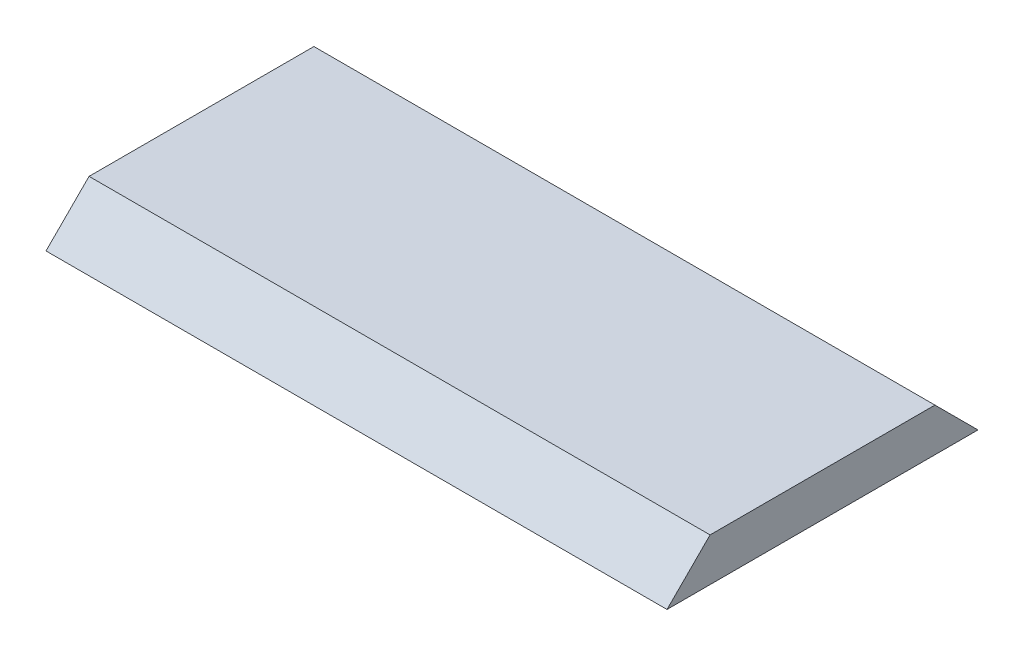
ISO-10303-21;
HEADER;
FILE_DESCRIPTION(('STEP AP214'),'2;1');
FILE_NAME('part.step','',(''),(''),'','','');
FILE_SCHEMA(('AUTOMOTIVE_DESIGN { 1 0 10303 214 1 1 1 1 }'));
ENDSEC;
DATA;
#1=APPLICATION_CONTEXT('core data for automotive mechanical design processes');
#2=APPLICATION_PROTOCOL_DEFINITION('international standard','automotive_design',2000,#1);
#3=PRODUCT_CONTEXT('',#1,'mechanical');
#4=PRODUCT('Part','Part','',(#3));
#5=PRODUCT_RELATED_PRODUCT_CATEGORY('part','',(#4));
#6=PRODUCT_DEFINITION_FORMATION('','',#4);
#7=PRODUCT_DEFINITION_CONTEXT('part definition',#1,'design');
#8=PRODUCT_DEFINITION('design','',#6,#7);
#9=PRODUCT_DEFINITION_SHAPE('','',#8);
#10=(LENGTH_UNIT() NAMED_UNIT(*) SI_UNIT(.MILLI.,.METRE.));
#11=(NAMED_UNIT(*) PLANE_ANGLE_UNIT() SI_UNIT($,.RADIAN.));
#12=(NAMED_UNIT(*) SI_UNIT($,.STERADIAN.) SOLID_ANGLE_UNIT());
#13=UNCERTAINTY_MEASURE_WITH_UNIT(LENGTH_MEASURE(1.E-05),#10,'distance_accuracy_value','');
#14=(GEOMETRIC_REPRESENTATION_CONTEXT(3) GLOBAL_UNCERTAINTY_ASSIGNED_CONTEXT((#13)) GLOBAL_UNIT_ASSIGNED_CONTEXT((#10,
#11,#12)) REPRESENTATION_CONTEXT('',''));
#15=CARTESIAN_POINT('',(0.,0.,0.));
#16=DIRECTION('',(0.,0.,1.));
#17=DIRECTION('',(1.,0.,0.));
#18=AXIS2_PLACEMENT_3D('',#15,#16,#17);
#19=CARTESIAN_POINT('',(64.9,9.,-32.5));
#20=DIRECTION('',(-1.,0.,0.));
#21=DIRECTION('',(0.,0.,1.));
#22=AXIS2_PLACEMENT_3D('',#19,#20,#21);
#23=PLANE('',#22);
#24=DIRECTION('',(0.,0.,-1.));
#25=VECTOR('',#24,1.);
#26=CARTESIAN_POINT('',(64.9,9.,-32.5));
#27=LINE('',#26,#25);
#28=CARTESIAN_POINT('',(64.9,9.,23.5));
#29=VERTEX_POINT('',#28);
#30=CARTESIAN_POINT('',(64.9,9.,-23.5));
#31=VERTEX_POINT('',#30);
#32=EDGE_CURVE('E110',#29,#31,#27,.T.);
#33=ORIENTED_EDGE('',*,*,#32,.F.);
#34=DIRECTION('',(0.,-0.707106781186549,0.707106781186546));
#35=VECTOR('',#34,1.);
#36=CARTESIAN_POINT('',(64.9,8.99999999999999,23.5));
#37=LINE('',#36,#35);
#38=CARTESIAN_POINT('',(64.9,0.,32.5));
#39=VERTEX_POINT('',#38);
#40=EDGE_CURVE('E95',#29,#39,#37,.T.);
#41=ORIENTED_EDGE('',*,*,#40,.T.);
#42=DIRECTION('',(0.,0.,-1.));
#43=VECTOR('',#42,1.);
#44=CARTESIAN_POINT('',(64.9,0.,-32.5));
#45=LINE('',#44,#43);
#46=CARTESIAN_POINT('',(64.9,0.,-32.5));
#47=VERTEX_POINT('',#46);
#48=EDGE_CURVE('E86',#39,#47,#45,.T.);
#49=ORIENTED_EDGE('',*,*,#48,.T.);
#50=DIRECTION('',(0.,0.707106781186549,0.707106781186546));
#51=VECTOR('',#50,1.);
#52=CARTESIAN_POINT('',(64.9,9.00000000000001,-23.5));
#53=LINE('',#52,#51);
#54=EDGE_CURVE('E93',#47,#31,#53,.T.);
#55=ORIENTED_EDGE('',*,*,#54,.T.);
#56=EDGE_LOOP('',(#33,#41,#49,#55));
#57=FACE_BOUND('',#56,.T.);
#58=ADVANCED_FACE('F41',(#57),#23,.F.);
#59=CARTESIAN_POINT('',(-64.9,9.,-32.5));
#60=DIRECTION('',(1.,0.,0.));
#61=DIRECTION('',(0.,0.,-1.));
#62=AXIS2_PLACEMENT_3D('',#59,#60,#61);
#63=PLANE('',#62);
#64=DIRECTION('',(0.,0.,1.));
#65=VECTOR('',#64,1.);
#66=CARTESIAN_POINT('',(-64.9,0.,-32.5));
#67=LINE('',#66,#65);
#68=CARTESIAN_POINT('',(-64.9,0.,-32.5));
#69=VERTEX_POINT('',#68);
#70=CARTESIAN_POINT('',(-64.9,0.,32.5));
#71=VERTEX_POINT('',#70);
#72=EDGE_CURVE('E88',#69,#71,#67,.T.);
#73=ORIENTED_EDGE('',*,*,#72,.T.);
#74=DIRECTION('',(0.,0.707106781186549,-0.707106781186546));
#75=VECTOR('',#74,1.);
#76=CARTESIAN_POINT('',(-64.9,8.99999999999999,23.5));
#77=LINE('',#76,#75);
#78=CARTESIAN_POINT('',(-64.9,9.,23.5));
#79=VERTEX_POINT('',#78);
#80=EDGE_CURVE('E11',#71,#79,#77,.T.);
#81=ORIENTED_EDGE('',*,*,#80,.T.);
#82=DIRECTION('',(0.,0.,1.));
#83=VECTOR('',#82,1.);
#84=CARTESIAN_POINT('',(-64.9,9.,-32.5));
#85=LINE('',#84,#83);
#86=CARTESIAN_POINT('',(-64.9,9.,-23.5));
#87=VERTEX_POINT('',#86);
#88=EDGE_CURVE('E106',#87,#79,#85,.T.);
#89=ORIENTED_EDGE('',*,*,#88,.F.);
#90=DIRECTION('',(0.,-0.707106781186549,-0.707106781186546));
#91=VECTOR('',#90,1.);
#92=CARTESIAN_POINT('',(-64.9,9.00000000000001,-23.5));
#93=LINE('',#92,#91);
#94=EDGE_CURVE('E50',#87,#69,#93,.T.);
#95=ORIENTED_EDGE('',*,*,#94,.T.);
#96=EDGE_LOOP('',(#73,#81,#89,#95));
#97=FACE_BOUND('',#96,.T.);
#98=ADVANCED_FACE('F105',(#97),#63,.F.);
#99=CARTESIAN_POINT('',(0.,9.,0.));
#100=DIRECTION('',(0.,1.,0.));
#101=DIRECTION('',(0.,0.,1.));
#102=AXIS2_PLACEMENT_3D('',#99,#100,#101);
#103=PLANE('',#102);
#104=ORIENTED_EDGE('',*,*,#88,.T.);
#105=DIRECTION('',(1.,0.,0.));
#106=VECTOR('',#105,1.);
#107=CARTESIAN_POINT('',(64.9,9.,23.5));
#108=LINE('',#107,#106);
#109=EDGE_CURVE('E99',#79,#29,#108,.T.);
#110=ORIENTED_EDGE('',*,*,#109,.T.);
#111=ORIENTED_EDGE('',*,*,#32,.T.);
#112=DIRECTION('',(-1.,0.,0.));
#113=VECTOR('',#112,1.);
#114=CARTESIAN_POINT('',(-64.9,9.,-23.5));
#115=LINE('',#114,#113);
#116=EDGE_CURVE('E98',#31,#87,#115,.T.);
#117=ORIENTED_EDGE('',*,*,#116,.T.);
#118=EDGE_LOOP('',(#104,#110,#111,#117));
#119=FACE_BOUND('',#118,.T.);
#120=ADVANCED_FACE('F152',(#119),#103,.T.);
#121=CARTESIAN_POINT('',(0.,0.,0.));
#122=DIRECTION('',(0.,1.,0.));
#123=DIRECTION('',(0.,0.,1.));
#124=AXIS2_PLACEMENT_3D('',#121,#122,#123);
#125=PLANE('',#124);
#126=CARTESIAN_POINT('',(-32.45,0.,-20.));
#127=DIRECTION('',(0.,1.,0.));
#128=DIRECTION('',(0.,0.,1.));
#129=AXIS2_PLACEMENT_3D('',#126,#127,#128);
#130=CIRCLE('',#129,3.35000000000003);
#131=CARTESIAN_POINT('',(-32.45,0.,-16.65));
#132=VERTEX_POINT('',#131);
#133=EDGE_CURVE('E135',#132,#132,#130,.T.);
#134=ORIENTED_EDGE('',*,*,#133,.T.);
#135=EDGE_LOOP('',(#134));
#136=FACE_BOUND('',#135,.T.);
#137=CARTESIAN_POINT('',(0.,0.,-20.));
#138=DIRECTION('',(0.,1.,0.));
#139=DIRECTION('',(0.,0.,1.));
#140=AXIS2_PLACEMENT_3D('',#137,#138,#139);
#141=CIRCLE('',#140,3.35000000000003);
#142=CARTESIAN_POINT('',(0.,0.,-16.65));
#143=VERTEX_POINT('',#142);
#144=EDGE_CURVE('E132',#143,#143,#141,.T.);
#145=ORIENTED_EDGE('',*,*,#144,.T.);
#146=EDGE_LOOP('',(#145));
#147=FACE_BOUND('',#146,.T.);
#148=CARTESIAN_POINT('',(32.45,0.,-20.));
#149=DIRECTION('',(0.,1.,0.));
#150=DIRECTION('',(0.,0.,1.));
#151=AXIS2_PLACEMENT_3D('',#148,#149,#150);
#152=CIRCLE('',#151,3.35000000000003);
#153=CARTESIAN_POINT('',(32.45,0.,-16.65));
#154=VERTEX_POINT('',#153);
#155=EDGE_CURVE('E129',#154,#154,#152,.T.);
#156=ORIENTED_EDGE('',*,*,#155,.T.);
#157=EDGE_LOOP('',(#156));
#158=FACE_BOUND('',#157,.T.);
#159=CARTESIAN_POINT('',(32.45,0.,20.));
#160=DIRECTION('',(0.,1.,0.));
#161=DIRECTION('',(0.,0.,1.));
#162=AXIS2_PLACEMENT_3D('',#159,#160,#161);
#163=CIRCLE('',#162,3.35000000000003);
#164=CARTESIAN_POINT('',(32.45,0.,23.35));
#165=VERTEX_POINT('',#164);
#166=EDGE_CURVE('E126',#165,#165,#163,.T.);
#167=ORIENTED_EDGE('',*,*,#166,.T.);
#168=EDGE_LOOP('',(#167));
#169=FACE_BOUND('',#168,.T.);
#170=CARTESIAN_POINT('',(0.,0.,20.));
#171=DIRECTION('',(0.,1.,0.));
#172=DIRECTION('',(0.,0.,1.));
#173=AXIS2_PLACEMENT_3D('',#170,#171,#172);
#174=CIRCLE('',#173,3.35000000000003);
#175=CARTESIAN_POINT('',(0.,0.,23.35));
#176=VERTEX_POINT('',#175);
#177=EDGE_CURVE('E123',#176,#176,#174,.T.);
#178=ORIENTED_EDGE('',*,*,#177,.T.);
#179=EDGE_LOOP('',(#178));
#180=FACE_BOUND('',#179,.T.);
#181=CARTESIAN_POINT('',(-32.45,0.,20.));
#182=DIRECTION('',(0.,1.,0.));
#183=DIRECTION('',(0.,0.,1.));
#184=AXIS2_PLACEMENT_3D('',#181,#182,#183);
#185=CIRCLE('',#184,3.35000000000003);
#186=CARTESIAN_POINT('',(-32.45,0.,23.35));
#187=VERTEX_POINT('',#186);
#188=EDGE_CURVE('E113',#187,#187,#185,.T.);
#189=ORIENTED_EDGE('',*,*,#188,.T.);
#190=EDGE_LOOP('',(#189));
#191=FACE_BOUND('',#190,.T.);
#192=ORIENTED_EDGE('',*,*,#48,.F.);
#193=DIRECTION('',(1.,0.,0.));
#194=VECTOR('',#193,1.);
#195=CARTESIAN_POINT('',(-64.9,0.,32.5));
#196=LINE('',#195,#194);
#197=EDGE_CURVE('E115',#71,#39,#196,.T.);
#198=ORIENTED_EDGE('',*,*,#197,.F.);
#199=ORIENTED_EDGE('',*,*,#72,.F.);
#200=DIRECTION('',(-1.,0.,0.));
#201=VECTOR('',#200,1.);
#202=CARTESIAN_POINT('',(-64.9,0.,-32.5));
#203=LINE('',#202,#201);
#204=EDGE_CURVE('E82',#47,#69,#203,.T.);
#205=ORIENTED_EDGE('',*,*,#204,.F.);
#206=EDGE_LOOP('',(#192,#198,#199,#205));
#207=FACE_BOUND('',#206,.T.);
#208=ADVANCED_FACE('F84',(#136,#147,#158,#169,#180,#191,#207),#125,.F.);
#209=CARTESIAN_POINT('',(-32.45,8.,20.));
#210=DIRECTION('',(0.,-1.,0.));
#211=DIRECTION('',(0.,0.,-1.));
#212=AXIS2_PLACEMENT_3D('',#209,#210,#211);
#213=CYLINDRICAL_SURFACE('',#212,2.35);
#214=CARTESIAN_POINT('',(-32.45,1.00000000000003,20.));
#215=DIRECTION('',(0.,1.,0.));
#216=DIRECTION('',(0.,0.,1.));
#217=AXIS2_PLACEMENT_3D('',#214,#215,#216);
#218=CIRCLE('',#217,2.35);
#219=CARTESIAN_POINT('',(-32.45,1.00000000000003,22.35));
#220=VERTEX_POINT('',#219);
#221=EDGE_CURVE('E150',#220,#220,#218,.F.);
#222=ORIENTED_EDGE('',*,*,#221,.T.);
#223=EDGE_LOOP('',(#222));
#224=FACE_BOUND('',#223,.T.);
#225=CARTESIAN_POINT('',(-32.45,8.,20.));
#226=DIRECTION('',(0.,-1.,0.));
#227=DIRECTION('',(0.,0.,-1.));
#228=AXIS2_PLACEMENT_3D('',#225,#226,#227);
#229=CIRCLE('',#228,2.35);
#230=CARTESIAN_POINT('',(-32.45,8.,17.65));
#231=VERTEX_POINT('',#230);
#232=EDGE_CURVE('E96',#231,#231,#229,.T.);
#233=ORIENTED_EDGE('',*,*,#232,.F.);
#234=EDGE_LOOP('',(#233));
#235=FACE_BOUND('',#234,.T.);
#236=ADVANCED_FACE('F266',(#224,#235),#213,.F.);
#237=CARTESIAN_POINT('',(-32.45,8.,20.));
#238=DIRECTION('',(0.,-1.,0.));
#239=DIRECTION('',(0.,0.,-1.));
#240=AXIS2_PLACEMENT_3D('',#237,#238,#239);
#241=PLANE('',#240);
#242=ORIENTED_EDGE('',*,*,#232,.T.);
#243=EDGE_LOOP('',(#242));
#244=FACE_BOUND('',#243,.T.);
#245=ADVANCED_FACE('F225',(#244),#241,.T.);
#246=CARTESIAN_POINT('',(0.,8.,20.));
#247=DIRECTION('',(0.,-1.,0.));
#248=DIRECTION('',(0.,0.,-1.));
#249=AXIS2_PLACEMENT_3D('',#246,#247,#248);
#250=CYLINDRICAL_SURFACE('',#249,2.35);
#251=CARTESIAN_POINT('',(0.,1.00000000000003,20.));
#252=DIRECTION('',(0.,1.,0.));
#253=DIRECTION('',(0.,0.,1.));
#254=AXIS2_PLACEMENT_3D('',#251,#252,#253);
#255=CIRCLE('',#254,2.35);
#256=CARTESIAN_POINT('',(0.,1.00000000000003,22.35));
#257=VERTEX_POINT('',#256);
#258=EDGE_CURVE('E147',#257,#257,#255,.F.);
#259=ORIENTED_EDGE('',*,*,#258,.T.);
#260=EDGE_LOOP('',(#259));
#261=FACE_BOUND('',#260,.T.);
#262=CARTESIAN_POINT('',(0.,8.,20.));
#263=DIRECTION('',(0.,-1.,0.));
#264=DIRECTION('',(0.,0.,-1.));
#265=AXIS2_PLACEMENT_3D('',#262,#263,#264);
#266=CIRCLE('',#265,2.35);
#267=CARTESIAN_POINT('',(0.,8.,17.65));
#268=VERTEX_POINT('',#267);
#269=EDGE_CURVE('E229',#268,#268,#266,.T.);
#270=ORIENTED_EDGE('',*,*,#269,.F.);
#271=EDGE_LOOP('',(#270));
#272=FACE_BOUND('',#271,.T.);
#273=ADVANCED_FACE('F221',(#261,#272),#250,.F.);
#274=CARTESIAN_POINT('',(0.,8.,20.));
#275=DIRECTION('',(0.,-1.,0.));
#276=DIRECTION('',(0.,0.,-1.));
#277=AXIS2_PLACEMENT_3D('',#274,#275,#276);
#278=PLANE('',#277);
#279=ORIENTED_EDGE('',*,*,#269,.T.);
#280=EDGE_LOOP('',(#279));
#281=FACE_BOUND('',#280,.T.);
#282=ADVANCED_FACE('F224',(#281),#278,.T.);
#283=CARTESIAN_POINT('',(32.45,8.,20.));
#284=DIRECTION('',(0.,-1.,0.));
#285=DIRECTION('',(0.,0.,-1.));
#286=AXIS2_PLACEMENT_3D('',#283,#284,#285);
#287=CYLINDRICAL_SURFACE('',#286,2.35);
#288=CARTESIAN_POINT('',(32.45,1.00000000000003,20.));
#289=DIRECTION('',(0.,1.,0.));
#290=DIRECTION('',(0.,0.,1.));
#291=AXIS2_PLACEMENT_3D('',#288,#289,#290);
#292=CIRCLE('',#291,2.35);
#293=CARTESIAN_POINT('',(32.45,1.00000000000003,22.35));
#294=VERTEX_POINT('',#293);
#295=EDGE_CURVE('E144',#294,#294,#292,.F.);
#296=ORIENTED_EDGE('',*,*,#295,.T.);
#297=EDGE_LOOP('',(#296));
#298=FACE_BOUND('',#297,.T.);
#299=CARTESIAN_POINT('',(32.45,8.,20.));
#300=DIRECTION('',(0.,-1.,0.));
#301=DIRECTION('',(0.,0.,-1.));
#302=AXIS2_PLACEMENT_3D('',#299,#300,#301);
#303=CIRCLE('',#302,2.35);
#304=CARTESIAN_POINT('',(32.45,8.,17.65));
#305=VERTEX_POINT('',#304);
#306=EDGE_CURVE('E231',#305,#305,#303,.T.);
#307=ORIENTED_EDGE('',*,*,#306,.F.);
#308=EDGE_LOOP('',(#307));
#309=FACE_BOUND('',#308,.T.);
#310=ADVANCED_FACE('F292',(#298,#309),#287,.F.);
#311=CARTESIAN_POINT('',(32.45,8.,20.));
#312=DIRECTION('',(0.,-1.,0.));
#313=DIRECTION('',(0.,0.,-1.));
#314=AXIS2_PLACEMENT_3D('',#311,#312,#313);
#315=PLANE('',#314);
#316=ORIENTED_EDGE('',*,*,#306,.T.);
#317=EDGE_LOOP('',(#316));
#318=FACE_BOUND('',#317,.T.);
#319=ADVANCED_FACE('F295',(#318),#315,.T.);
#320=CARTESIAN_POINT('',(32.45,8.,-20.));
#321=DIRECTION('',(0.,-1.,0.));
#322=DIRECTION('',(0.,0.,-1.));
#323=AXIS2_PLACEMENT_3D('',#320,#321,#322);
#324=CYLINDRICAL_SURFACE('',#323,2.35);
#325=CARTESIAN_POINT('',(32.45,1.00000000000003,-20.));
#326=DIRECTION('',(0.,1.,0.));
#327=DIRECTION('',(0.,0.,1.));
#328=AXIS2_PLACEMENT_3D('',#325,#326,#327);
#329=CIRCLE('',#328,2.35);
#330=CARTESIAN_POINT('',(32.45,1.00000000000003,-17.65));
#331=VERTEX_POINT('',#330);
#332=EDGE_CURVE('E141',#331,#331,#329,.F.);
#333=ORIENTED_EDGE('',*,*,#332,.T.);
#334=EDGE_LOOP('',(#333));
#335=FACE_BOUND('',#334,.T.);
#336=CARTESIAN_POINT('',(32.45,8.,-20.));
#337=DIRECTION('',(0.,-1.,0.));
#338=DIRECTION('',(0.,0.,1.));
#339=AXIS2_PLACEMENT_3D('',#336,#337,#338);
#340=CIRCLE('',#339,2.35);
#341=CARTESIAN_POINT('',(32.45,8.,-17.65));
#342=VERTEX_POINT('',#341);
#343=EDGE_CURVE('E235',#342,#342,#340,.T.);
#344=ORIENTED_EDGE('',*,*,#343,.F.);
#345=EDGE_LOOP('',(#344));
#346=FACE_BOUND('',#345,.T.);
#347=ADVANCED_FACE('F300',(#335,#346),#324,.F.);
#348=CARTESIAN_POINT('',(32.45,8.,-20.));
#349=DIRECTION('',(0.,1.,0.));
#350=DIRECTION('',(0.,0.,1.));
#351=AXIS2_PLACEMENT_3D('',#348,#349,#350);
#352=PLANE('',#351);
#353=ORIENTED_EDGE('',*,*,#343,.T.);
#354=EDGE_LOOP('',(#353));
#355=FACE_BOUND('',#354,.T.);
#356=ADVANCED_FACE('F307',(#355),#352,.F.);
#357=CARTESIAN_POINT('',(0.,8.,-20.));
#358=DIRECTION('',(0.,-1.,0.));
#359=DIRECTION('',(0.,0.,-1.));
#360=AXIS2_PLACEMENT_3D('',#357,#358,#359);
#361=CYLINDRICAL_SURFACE('',#360,2.35);
#362=CARTESIAN_POINT('',(0.,1.00000000000003,-20.));
#363=DIRECTION('',(0.,1.,0.));
#364=DIRECTION('',(0.,0.,1.));
#365=AXIS2_PLACEMENT_3D('',#362,#363,#364);
#366=CIRCLE('',#365,2.35);
#367=CARTESIAN_POINT('',(0.,1.00000000000003,-17.65));
#368=VERTEX_POINT('',#367);
#369=EDGE_CURVE('E138',#368,#368,#366,.F.);
#370=ORIENTED_EDGE('',*,*,#369,.T.);
#371=EDGE_LOOP('',(#370));
#372=FACE_BOUND('',#371,.T.);
#373=CARTESIAN_POINT('',(0.,8.,-20.));
#374=DIRECTION('',(0.,-1.,0.));
#375=DIRECTION('',(0.,0.,1.));
#376=AXIS2_PLACEMENT_3D('',#373,#374,#375);
#377=CIRCLE('',#376,2.35);
#378=CARTESIAN_POINT('',(0.,8.,-17.65));
#379=VERTEX_POINT('',#378);
#380=EDGE_CURVE('E240',#379,#379,#377,.T.);
#381=ORIENTED_EDGE('',*,*,#380,.F.);
#382=EDGE_LOOP('',(#381));
#383=FACE_BOUND('',#382,.T.);
#384=ADVANCED_FACE('F259',(#372,#383),#361,.F.);
#385=CARTESIAN_POINT('',(0.,8.,-20.));
#386=DIRECTION('',(0.,1.,0.));
#387=DIRECTION('',(0.,0.,1.));
#388=AXIS2_PLACEMENT_3D('',#385,#386,#387);
#389=PLANE('',#388);
#390=ORIENTED_EDGE('',*,*,#380,.T.);
#391=EDGE_LOOP('',(#390));
#392=FACE_BOUND('',#391,.T.);
#393=ADVANCED_FACE('F250',(#392),#389,.F.);
#394=CARTESIAN_POINT('',(-32.45,8.,-20.));
#395=DIRECTION('',(0.,-1.,0.));
#396=DIRECTION('',(0.,0.,-1.));
#397=AXIS2_PLACEMENT_3D('',#394,#395,#396);
#398=CYLINDRICAL_SURFACE('',#397,2.35);
#399=CARTESIAN_POINT('',(-32.45,1.00000000000003,-20.));
#400=DIRECTION('',(0.,1.,0.));
#401=DIRECTION('',(0.,0.,1.));
#402=AXIS2_PLACEMENT_3D('',#399,#400,#401);
#403=CIRCLE('',#402,2.35);
#404=CARTESIAN_POINT('',(-32.45,1.00000000000003,-17.65));
#405=VERTEX_POINT('',#404);
#406=EDGE_CURVE('E109',#405,#405,#403,.F.);
#407=ORIENTED_EDGE('',*,*,#406,.T.);
#408=EDGE_LOOP('',(#407));
#409=FACE_BOUND('',#408,.T.);
#410=CARTESIAN_POINT('',(-32.45,8.,-20.));
#411=DIRECTION('',(0.,-1.,0.));
#412=DIRECTION('',(0.,0.,1.));
#413=AXIS2_PLACEMENT_3D('',#410,#411,#412);
#414=CIRCLE('',#413,2.35);
#415=CARTESIAN_POINT('',(-32.45,8.,-17.65));
#416=VERTEX_POINT('',#415);
#417=EDGE_CURVE('E243',#416,#416,#414,.T.);
#418=ORIENTED_EDGE('',*,*,#417,.F.);
#419=EDGE_LOOP('',(#418));
#420=FACE_BOUND('',#419,.T.);
#421=ADVANCED_FACE('F248',(#409,#420),#398,.F.);
#422=CARTESIAN_POINT('',(-32.45,8.,-20.));
#423=DIRECTION('',(0.,1.,0.));
#424=DIRECTION('',(0.,0.,1.));
#425=AXIS2_PLACEMENT_3D('',#422,#423,#424);
#426=PLANE('',#425);
#427=ORIENTED_EDGE('',*,*,#417,.T.);
#428=EDGE_LOOP('',(#427));
#429=FACE_BOUND('',#428,.T.);
#430=ADVANCED_FACE('F182',(#429),#426,.F.);
#431=CARTESIAN_POINT('',(-32.45,1.00000000000003,-20.));
#432=DIRECTION('',(0.,-1.,0.));
#433=DIRECTION('',(0.,0.,-1.));
#434=AXIS2_PLACEMENT_3D('',#431,#432,#433);
#435=CONICAL_SURFACE('',#434,2.35,0.785398163397451);
#436=ORIENTED_EDGE('',*,*,#133,.F.);
#437=EDGE_LOOP('',(#436));
#438=FACE_BOUND('',#437,.T.);
#439=ORIENTED_EDGE('',*,*,#406,.F.);
#440=EDGE_LOOP('',(#439));
#441=FACE_BOUND('',#440,.T.);
#442=ADVANCED_FACE('F175',(#438,#441),#435,.F.);
#443=CARTESIAN_POINT('',(0.,1.00000000000003,-20.));
#444=DIRECTION('',(0.,-1.,0.));
#445=DIRECTION('',(0.,0.,-1.));
#446=AXIS2_PLACEMENT_3D('',#443,#444,#445);
#447=CONICAL_SURFACE('',#446,2.35,0.785398163397451);
#448=ORIENTED_EDGE('',*,*,#144,.F.);
#449=EDGE_LOOP('',(#448));
#450=FACE_BOUND('',#449,.T.);
#451=ORIENTED_EDGE('',*,*,#369,.F.);
#452=EDGE_LOOP('',(#451));
#453=FACE_BOUND('',#452,.T.);
#454=ADVANCED_FACE('F181',(#450,#453),#447,.F.);
#455=CARTESIAN_POINT('',(32.45,1.00000000000003,-20.));
#456=DIRECTION('',(0.,-1.,0.));
#457=DIRECTION('',(0.,0.,-1.));
#458=AXIS2_PLACEMENT_3D('',#455,#456,#457);
#459=CONICAL_SURFACE('',#458,2.35,0.785398163397451);
#460=ORIENTED_EDGE('',*,*,#155,.F.);
#461=EDGE_LOOP('',(#460));
#462=FACE_BOUND('',#461,.T.);
#463=ORIENTED_EDGE('',*,*,#332,.F.);
#464=EDGE_LOOP('',(#463));
#465=FACE_BOUND('',#464,.T.);
#466=ADVANCED_FACE('F189',(#462,#465),#459,.F.);
#467=CARTESIAN_POINT('',(32.45,1.00000000000003,20.));
#468=DIRECTION('',(0.,-1.,0.));
#469=DIRECTION('',(0.,0.,-1.));
#470=AXIS2_PLACEMENT_3D('',#467,#468,#469);
#471=CONICAL_SURFACE('',#470,2.35,0.785398163397451);
#472=ORIENTED_EDGE('',*,*,#166,.F.);
#473=EDGE_LOOP('',(#472));
#474=FACE_BOUND('',#473,.T.);
#475=ORIENTED_EDGE('',*,*,#295,.F.);
#476=EDGE_LOOP('',(#475));
#477=FACE_BOUND('',#476,.T.);
#478=ADVANCED_FACE('F196',(#474,#477),#471,.F.);
#479=CARTESIAN_POINT('',(0.,1.00000000000003,20.));
#480=DIRECTION('',(0.,-1.,0.));
#481=DIRECTION('',(0.,0.,-1.));
#482=AXIS2_PLACEMENT_3D('',#479,#480,#481);
#483=CONICAL_SURFACE('',#482,2.35,0.785398163397451);
#484=ORIENTED_EDGE('',*,*,#177,.F.);
#485=EDGE_LOOP('',(#484));
#486=FACE_BOUND('',#485,.T.);
#487=ORIENTED_EDGE('',*,*,#258,.F.);
#488=EDGE_LOOP('',(#487));
#489=FACE_BOUND('',#488,.T.);
#490=ADVANCED_FACE('F162',(#486,#489),#483,.F.);
#491=CARTESIAN_POINT('',(-32.45,1.00000000000003,20.));
#492=DIRECTION('',(0.,-1.,0.));
#493=DIRECTION('',(0.,0.,-1.));
#494=AXIS2_PLACEMENT_3D('',#491,#492,#493);
#495=CONICAL_SURFACE('',#494,2.35,0.785398163397451);
#496=ORIENTED_EDGE('',*,*,#188,.F.);
#497=EDGE_LOOP('',(#496));
#498=FACE_BOUND('',#497,.T.);
#499=ORIENTED_EDGE('',*,*,#221,.F.);
#500=EDGE_LOOP('',(#499));
#501=FACE_BOUND('',#500,.T.);
#502=ADVANCED_FACE('F156',(#498,#501),#495,.F.);
#503=CARTESIAN_POINT('',(0.,9.,23.5));
#504=DIRECTION('',(0.,0.707106781186546,0.707106781186549));
#505=DIRECTION('',(-1.,0.,0.));
#506=AXIS2_PLACEMENT_3D('',#503,#504,#505);
#507=PLANE('',#506);
#508=ORIENTED_EDGE('',*,*,#80,.F.);
#509=ORIENTED_EDGE('',*,*,#197,.T.);
#510=ORIENTED_EDGE('',*,*,#40,.F.);
#511=ORIENTED_EDGE('',*,*,#109,.F.);
#512=EDGE_LOOP('',(#508,#509,#510,#511));
#513=FACE_BOUND('',#512,.T.);
#514=ADVANCED_FACE('F154',(#513),#507,.T.);
#515=CARTESIAN_POINT('',(0.,9.,-23.5));
#516=DIRECTION('',(0.,0.707106781186546,-0.707106781186549));
#517=DIRECTION('',(1.,0.,0.));
#518=AXIS2_PLACEMENT_3D('',#515,#516,#517);
#519=PLANE('',#518);
#520=ORIENTED_EDGE('',*,*,#54,.F.);
#521=ORIENTED_EDGE('',*,*,#204,.T.);
#522=ORIENTED_EDGE('',*,*,#94,.F.);
#523=ORIENTED_EDGE('',*,*,#116,.F.);
#524=EDGE_LOOP('',(#520,#521,#522,#523));
#525=FACE_BOUND('',#524,.T.);
#526=ADVANCED_FACE('F44',(#525),#519,.T.);
#527=CLOSED_SHELL('',(#58,#98,#120,#208,#236,#245,#273,#282,#310,#319,#347,#356,#384,#393,#421,
#430,#442,#454,#466,#478,#490,#502,#514,#526));
#528=MANIFOLD_SOLID_BREP('B2',#527);
#529=ADVANCED_BREP_SHAPE_REPRESENTATION('',(#18,#528),#14);
#530=SHAPE_DEFINITION_REPRESENTATION(#9,#529);
ENDSEC;
END-ISO-10303-21;
